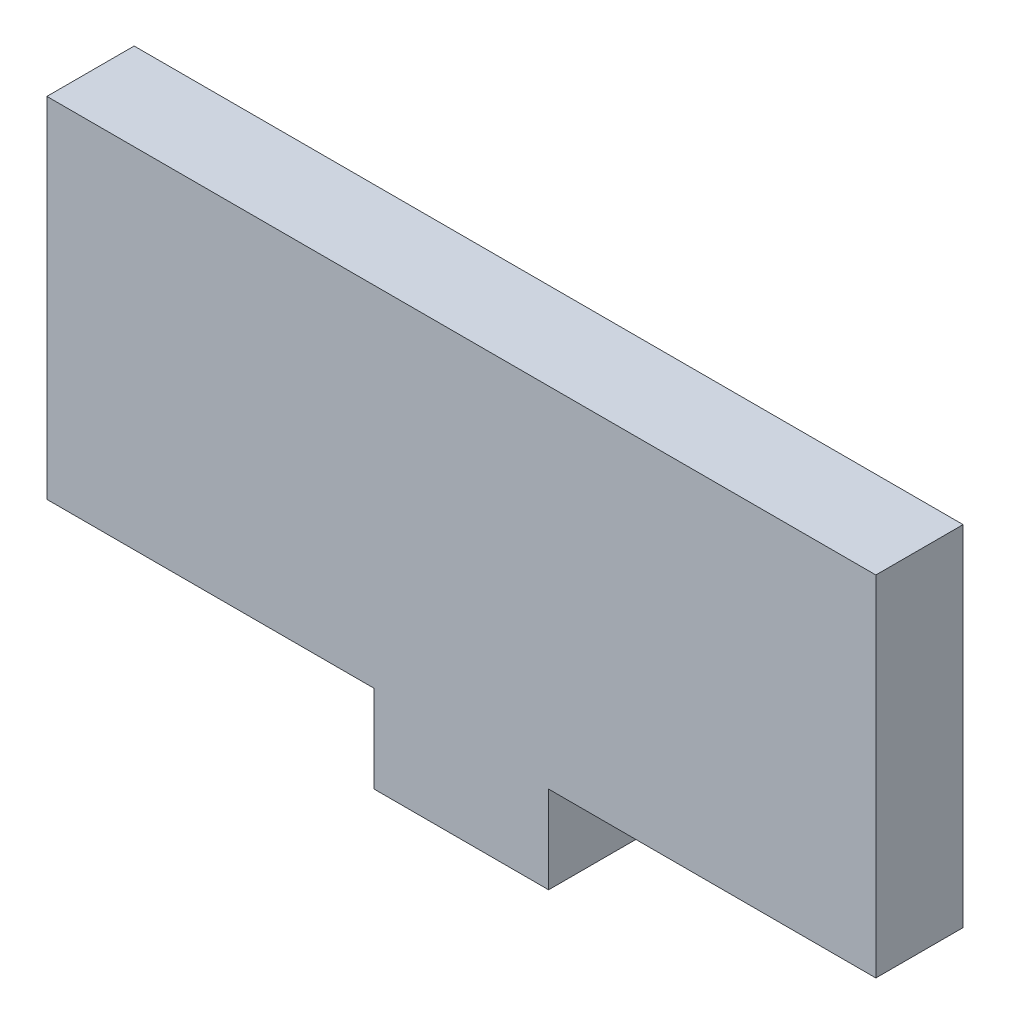
ISO-10303-21;
HEADER;
FILE_DESCRIPTION(('STEP AP214'),'2;1');
FILE_NAME('part.step','',(''),(''),'','','');
FILE_SCHEMA(('AUTOMOTIVE_DESIGN { 1 0 10303 214 1 1 1 1 }'));
ENDSEC;
DATA;
#1=APPLICATION_CONTEXT('core data for automotive mechanical design processes');
#2=APPLICATION_PROTOCOL_DEFINITION('international standard','automotive_design',2000,#1);
#3=PRODUCT_CONTEXT('',#1,'mechanical');
#4=PRODUCT('Part','Part','',(#3));
#5=PRODUCT_RELATED_PRODUCT_CATEGORY('part','',(#4));
#6=PRODUCT_DEFINITION_FORMATION('','',#4);
#7=PRODUCT_DEFINITION_CONTEXT('part definition',#1,'design');
#8=PRODUCT_DEFINITION('design','',#6,#7);
#9=PRODUCT_DEFINITION_SHAPE('','',#8);
#10=(LENGTH_UNIT() NAMED_UNIT(*) SI_UNIT(.MILLI.,.METRE.));
#11=(NAMED_UNIT(*) PLANE_ANGLE_UNIT() SI_UNIT($,.RADIAN.));
#12=(NAMED_UNIT(*) SI_UNIT($,.STERADIAN.) SOLID_ANGLE_UNIT());
#13=UNCERTAINTY_MEASURE_WITH_UNIT(LENGTH_MEASURE(1.E-05),#10,'distance_accuracy_value','');
#14=(GEOMETRIC_REPRESENTATION_CONTEXT(3) GLOBAL_UNCERTAINTY_ASSIGNED_CONTEXT((#13)) GLOBAL_UNIT_ASSIGNED_CONTEXT((#10,
#11,#12)) REPRESENTATION_CONTEXT('',''));
#15=CARTESIAN_POINT('',(0.,0.,0.));
#16=DIRECTION('',(0.,0.,1.));
#17=DIRECTION('',(1.,0.,0.));
#18=AXIS2_PLACEMENT_3D('',#15,#16,#17);
#19=CARTESIAN_POINT('',(36.5125,0.,6.35));
#20=DIRECTION('',(1.,0.,0.));
#21=DIRECTION('',(0.,1.,0.));
#22=AXIS2_PLACEMENT_3D('',#19,#20,#21);
#23=PLANE('',#22);
#24=DIRECTION('',(0.,-1.,0.));
#25=VECTOR('',#24,1.);
#26=CARTESIAN_POINT('',(36.5125,0.,0.));
#27=LINE('',#26,#25);
#28=CARTESIAN_POINT('',(36.5125,0.,0.));
#29=VERTEX_POINT('',#28);
#30=CARTESIAN_POINT('',(36.5125,-6.35,0.));
#31=VERTEX_POINT('',#30);
#32=EDGE_CURVE('E139',#29,#31,#27,.T.);
#33=ORIENTED_EDGE('',*,*,#32,.F.);
#34=DIRECTION('',(0.,0.,-1.));
#35=VECTOR('',#34,1.);
#36=CARTESIAN_POINT('',(36.5125,0.,6.35));
#37=LINE('',#36,#35);
#38=CARTESIAN_POINT('',(36.5125,0.,6.35));
#39=VERTEX_POINT('',#38);
#40=EDGE_CURVE('E11',#39,#29,#37,.T.);
#41=ORIENTED_EDGE('',*,*,#40,.F.);
#42=DIRECTION('',(0.,-1.,0.));
#43=VECTOR('',#42,1.);
#44=CARTESIAN_POINT('',(36.5125,0.,6.35));
#45=LINE('',#44,#43);
#46=CARTESIAN_POINT('',(36.5125,-6.35,6.35));
#47=VERTEX_POINT('',#46);
#48=EDGE_CURVE('E163',#39,#47,#45,.T.);
#49=ORIENTED_EDGE('',*,*,#48,.T.);
#50=DIRECTION('',(0.,0.,-1.));
#51=VECTOR('',#50,1.);
#52=CARTESIAN_POINT('',(36.5125,-6.35,6.35));
#53=LINE('',#52,#51);
#54=EDGE_CURVE('E91',#47,#31,#53,.T.);
#55=ORIENTED_EDGE('',*,*,#54,.T.);
#56=EDGE_LOOP('',(#33,#41,#49,#55));
#57=FACE_BOUND('',#56,.T.);
#58=ADVANCED_FACE('F39',(#57),#23,.T.);
#59=CARTESIAN_POINT('',(0.,0.,6.35));
#60=DIRECTION('',(0.,1.,0.));
#61=DIRECTION('',(0.,0.,1.));
#62=AXIS2_PLACEMENT_3D('',#59,#60,#61);
#63=PLANE('',#62);
#64=DIRECTION('',(1.,0.,0.));
#65=VECTOR('',#64,1.);
#66=CARTESIAN_POINT('',(0.,0.,0.));
#67=LINE('',#66,#65);
#68=CARTESIAN_POINT('',(60.325,0.,0.));
#69=VERTEX_POINT('',#68);
#70=EDGE_CURVE('E143',#29,#69,#67,.T.);
#71=ORIENTED_EDGE('',*,*,#70,.T.);
#72=DIRECTION('',(0.,0.,-1.));
#73=VECTOR('',#72,1.);
#74=CARTESIAN_POINT('',(60.325,0.,6.35));
#75=LINE('',#74,#73);
#76=CARTESIAN_POINT('',(60.325,0.,6.35));
#77=VERTEX_POINT('',#76);
#78=EDGE_CURVE('E48',#77,#69,#75,.T.);
#79=ORIENTED_EDGE('',*,*,#78,.F.);
#80=DIRECTION('',(1.,0.,0.));
#81=VECTOR('',#80,1.);
#82=CARTESIAN_POINT('',(0.,0.,6.35));
#83=LINE('',#82,#81);
#84=EDGE_CURVE('E122',#39,#77,#83,.T.);
#85=ORIENTED_EDGE('',*,*,#84,.F.);
#86=ORIENTED_EDGE('',*,*,#40,.T.);
#87=EDGE_LOOP('',(#71,#79,#85,#86));
#88=FACE_BOUND('',#87,.T.);
#89=ADVANCED_FACE('F201',(#88),#63,.F.);
#90=CARTESIAN_POINT('',(60.325,0.,6.35));
#91=DIRECTION('',(-1.,0.,0.));
#92=DIRECTION('',(0.,0.,1.));
#93=AXIS2_PLACEMENT_3D('',#90,#91,#92);
#94=PLANE('',#93);
#95=DIRECTION('',(0.,1.,0.));
#96=VECTOR('',#95,1.);
#97=CARTESIAN_POINT('',(60.325,0.,0.));
#98=LINE('',#97,#96);
#99=CARTESIAN_POINT('',(60.325,25.4,0.));
#100=VERTEX_POINT('',#99);
#101=EDGE_CURVE('E146',#69,#100,#98,.T.);
#102=ORIENTED_EDGE('',*,*,#101,.T.);
#103=DIRECTION('',(0.,0.,-1.));
#104=VECTOR('',#103,1.);
#105=CARTESIAN_POINT('',(60.325,25.4,6.35));
#106=LINE('',#105,#104);
#107=CARTESIAN_POINT('',(60.325,25.4,6.35));
#108=VERTEX_POINT('',#107);
#109=EDGE_CURVE('E173',#108,#100,#106,.T.);
#110=ORIENTED_EDGE('',*,*,#109,.F.);
#111=DIRECTION('',(0.,1.,0.));
#112=VECTOR('',#111,1.);
#113=CARTESIAN_POINT('',(60.325,0.,6.35));
#114=LINE('',#113,#112);
#115=EDGE_CURVE('E183',#77,#108,#114,.T.);
#116=ORIENTED_EDGE('',*,*,#115,.F.);
#117=ORIENTED_EDGE('',*,*,#78,.T.);
#118=EDGE_LOOP('',(#102,#110,#116,#117));
#119=FACE_BOUND('',#118,.T.);
#120=ADVANCED_FACE('F181',(#119),#94,.F.);
#121=CARTESIAN_POINT('',(0.,25.4,6.35));
#122=DIRECTION('',(0.,1.,0.));
#123=DIRECTION('',(0.,0.,1.));
#124=AXIS2_PLACEMENT_3D('',#121,#122,#123);
#125=PLANE('',#124);
#126=DIRECTION('',(1.,0.,0.));
#127=VECTOR('',#126,1.);
#128=CARTESIAN_POINT('',(0.,25.4,0.));
#129=LINE('',#128,#127);
#130=CARTESIAN_POINT('',(0.,25.4,0.));
#131=VERTEX_POINT('',#130);
#132=EDGE_CURVE('E150',#131,#100,#129,.T.);
#133=ORIENTED_EDGE('',*,*,#132,.F.);
#134=DIRECTION('',(0.,0.,-1.));
#135=VECTOR('',#134,1.);
#136=CARTESIAN_POINT('',(0.,25.4,6.35));
#137=LINE('',#136,#135);
#138=CARTESIAN_POINT('',(0.,25.4,6.35));
#139=VERTEX_POINT('',#138);
#140=EDGE_CURVE('E170',#139,#131,#137,.T.);
#141=ORIENTED_EDGE('',*,*,#140,.F.);
#142=DIRECTION('',(1.,0.,0.));
#143=VECTOR('',#142,1.);
#144=CARTESIAN_POINT('',(0.,25.4,6.35));
#145=LINE('',#144,#143);
#146=EDGE_CURVE('E193',#139,#108,#145,.T.);
#147=ORIENTED_EDGE('',*,*,#146,.T.);
#148=ORIENTED_EDGE('',*,*,#109,.T.);
#149=EDGE_LOOP('',(#133,#141,#147,#148));
#150=FACE_BOUND('',#149,.T.);
#151=ADVANCED_FACE('F191',(#150),#125,.T.);
#152=CARTESIAN_POINT('',(0.,0.,6.35));
#153=DIRECTION('',(-1.,0.,0.));
#154=DIRECTION('',(0.,0.,1.));
#155=AXIS2_PLACEMENT_3D('',#152,#153,#154);
#156=PLANE('',#155);
#157=DIRECTION('',(0.,1.,0.));
#158=VECTOR('',#157,1.);
#159=CARTESIAN_POINT('',(0.,0.,0.));
#160=LINE('',#159,#158);
#161=CARTESIAN_POINT('',(0.,0.,0.));
#162=VERTEX_POINT('',#161);
#163=EDGE_CURVE('E154',#162,#131,#160,.T.);
#164=ORIENTED_EDGE('',*,*,#163,.F.);
#165=DIRECTION('',(0.,0.,-1.));
#166=VECTOR('',#165,1.);
#167=CARTESIAN_POINT('',(0.,0.,6.35));
#168=LINE('',#167,#166);
#169=CARTESIAN_POINT('',(0.,0.,6.35));
#170=VERTEX_POINT('',#169);
#171=EDGE_CURVE('E128',#170,#162,#168,.T.);
#172=ORIENTED_EDGE('',*,*,#171,.F.);
#173=DIRECTION('',(0.,1.,0.));
#174=VECTOR('',#173,1.);
#175=CARTESIAN_POINT('',(0.,0.,6.35));
#176=LINE('',#175,#174);
#177=EDGE_CURVE('E118',#170,#139,#176,.T.);
#178=ORIENTED_EDGE('',*,*,#177,.T.);
#179=ORIENTED_EDGE('',*,*,#140,.T.);
#180=EDGE_LOOP('',(#164,#172,#178,#179));
#181=FACE_BOUND('',#180,.T.);
#182=ADVANCED_FACE('F211',(#181),#156,.T.);
#183=CARTESIAN_POINT('',(23.8125,0.,0.));
#184=VERTEX_POINT('',#183);
#185=EDGE_CURVE('E126',#162,#184,#67,.T.);
#186=ORIENTED_EDGE('',*,*,#185,.T.);
#187=DIRECTION('',(0.,0.,-1.));
#188=VECTOR('',#187,1.);
#189=CARTESIAN_POINT('',(23.8125,0.,6.35));
#190=LINE('',#189,#188);
#191=CARTESIAN_POINT('',(23.8125,0.,6.35));
#192=VERTEX_POINT('',#191);
#193=EDGE_CURVE('E123',#192,#184,#190,.T.);
#194=ORIENTED_EDGE('',*,*,#193,.F.);
#195=EDGE_CURVE('E111',#170,#192,#83,.T.);
#196=ORIENTED_EDGE('',*,*,#195,.F.);
#197=ORIENTED_EDGE('',*,*,#171,.T.);
#198=EDGE_LOOP('',(#186,#194,#196,#197));
#199=FACE_BOUND('',#198,.T.);
#200=ADVANCED_FACE('F124',(#199),#63,.F.);
#201=CARTESIAN_POINT('',(23.8125,0.,6.35));
#202=DIRECTION('',(1.,0.,0.));
#203=DIRECTION('',(0.,1.,0.));
#204=AXIS2_PLACEMENT_3D('',#201,#202,#203);
#205=PLANE('',#204);
#206=DIRECTION('',(0.,-1.,0.));
#207=VECTOR('',#206,1.);
#208=CARTESIAN_POINT('',(23.8125,0.,0.));
#209=LINE('',#208,#207);
#210=CARTESIAN_POINT('',(23.8125,-6.35,0.));
#211=VERTEX_POINT('',#210);
#212=EDGE_CURVE('E84',#184,#211,#209,.T.);
#213=ORIENTED_EDGE('',*,*,#212,.T.);
#214=DIRECTION('',(0.,0.,-1.));
#215=VECTOR('',#214,1.);
#216=CARTESIAN_POINT('',(23.8125,-6.35,6.35));
#217=LINE('',#216,#215);
#218=CARTESIAN_POINT('',(23.8125,-6.35,6.35));
#219=VERTEX_POINT('',#218);
#220=EDGE_CURVE('E129',#219,#211,#217,.T.);
#221=ORIENTED_EDGE('',*,*,#220,.F.);
#222=DIRECTION('',(0.,-1.,0.));
#223=VECTOR('',#222,1.);
#224=CARTESIAN_POINT('',(23.8125,0.,6.35));
#225=LINE('',#224,#223);
#226=EDGE_CURVE('E115',#192,#219,#225,.T.);
#227=ORIENTED_EDGE('',*,*,#226,.F.);
#228=ORIENTED_EDGE('',*,*,#193,.T.);
#229=EDGE_LOOP('',(#213,#221,#227,#228));
#230=FACE_BOUND('',#229,.T.);
#231=ADVANCED_FACE('F131',(#230),#205,.F.);
#232=CARTESIAN_POINT('',(0.,-6.35,6.35));
#233=DIRECTION('',(0.,1.,0.));
#234=DIRECTION('',(-1.,0.,0.));
#235=AXIS2_PLACEMENT_3D('',#232,#233,#234);
#236=PLANE('',#235);
#237=DIRECTION('',(1.,0.,0.));
#238=VECTOR('',#237,1.);
#239=CARTESIAN_POINT('',(0.,-6.35,0.));
#240=LINE('',#239,#238);
#241=EDGE_CURVE('E160',#211,#31,#240,.T.);
#242=ORIENTED_EDGE('',*,*,#241,.T.);
#243=ORIENTED_EDGE('',*,*,#54,.F.);
#244=DIRECTION('',(1.,0.,0.));
#245=VECTOR('',#244,1.);
#246=CARTESIAN_POINT('',(0.,-6.35,6.35));
#247=LINE('',#246,#245);
#248=EDGE_CURVE('E56',#219,#47,#247,.T.);
#249=ORIENTED_EDGE('',*,*,#248,.F.);
#250=ORIENTED_EDGE('',*,*,#220,.T.);
#251=EDGE_LOOP('',(#242,#243,#249,#250));
#252=FACE_BOUND('',#251,.T.);
#253=ADVANCED_FACE('F216',(#252),#236,.F.);
#254=CARTESIAN_POINT('',(0.,0.,6.35));
#255=DIRECTION('',(0.,0.,1.));
#256=DIRECTION('',(1.,0.,0.));
#257=AXIS2_PLACEMENT_3D('',#254,#255,#256);
#258=PLANE('',#257);
#259=ORIENTED_EDGE('',*,*,#48,.F.);
#260=ORIENTED_EDGE('',*,*,#84,.T.);
#261=ORIENTED_EDGE('',*,*,#115,.T.);
#262=ORIENTED_EDGE('',*,*,#146,.F.);
#263=ORIENTED_EDGE('',*,*,#177,.F.);
#264=ORIENTED_EDGE('',*,*,#195,.T.);
#265=ORIENTED_EDGE('',*,*,#226,.T.);
#266=ORIENTED_EDGE('',*,*,#248,.T.);
#267=EDGE_LOOP('',(#259,#260,#261,#262,#263,#264,#265,#266));
#268=FACE_BOUND('',#267,.T.);
#269=ADVANCED_FACE('F113',(#268),#258,.T.);
#270=CARTESIAN_POINT('',(0.,0.,0.));
#271=DIRECTION('',(0.,0.,1.));
#272=DIRECTION('',(1.,0.,0.));
#273=AXIS2_PLACEMENT_3D('',#270,#271,#272);
#274=PLANE('',#273);
#275=ORIENTED_EDGE('',*,*,#32,.T.);
#276=ORIENTED_EDGE('',*,*,#241,.F.);
#277=ORIENTED_EDGE('',*,*,#212,.F.);
#278=ORIENTED_EDGE('',*,*,#185,.F.);
#279=ORIENTED_EDGE('',*,*,#163,.T.);
#280=ORIENTED_EDGE('',*,*,#132,.T.);
#281=ORIENTED_EDGE('',*,*,#101,.F.);
#282=ORIENTED_EDGE('',*,*,#70,.F.);
#283=EDGE_LOOP('',(#275,#276,#277,#278,#279,#280,#281,#282));
#284=FACE_BOUND('',#283,.T.);
#285=ADVANCED_FACE('F187',(#284),#274,.F.);
#286=CLOSED_SHELL('',(#58,#89,#120,#151,#182,#200,#231,#253,#269,#285));
#287=MANIFOLD_SOLID_BREP('B2',#286);
#288=ADVANCED_BREP_SHAPE_REPRESENTATION('',(#18,#287),#14);
#289=SHAPE_DEFINITION_REPRESENTATION(#9,#288);
ENDSEC;
END-ISO-10303-21;
